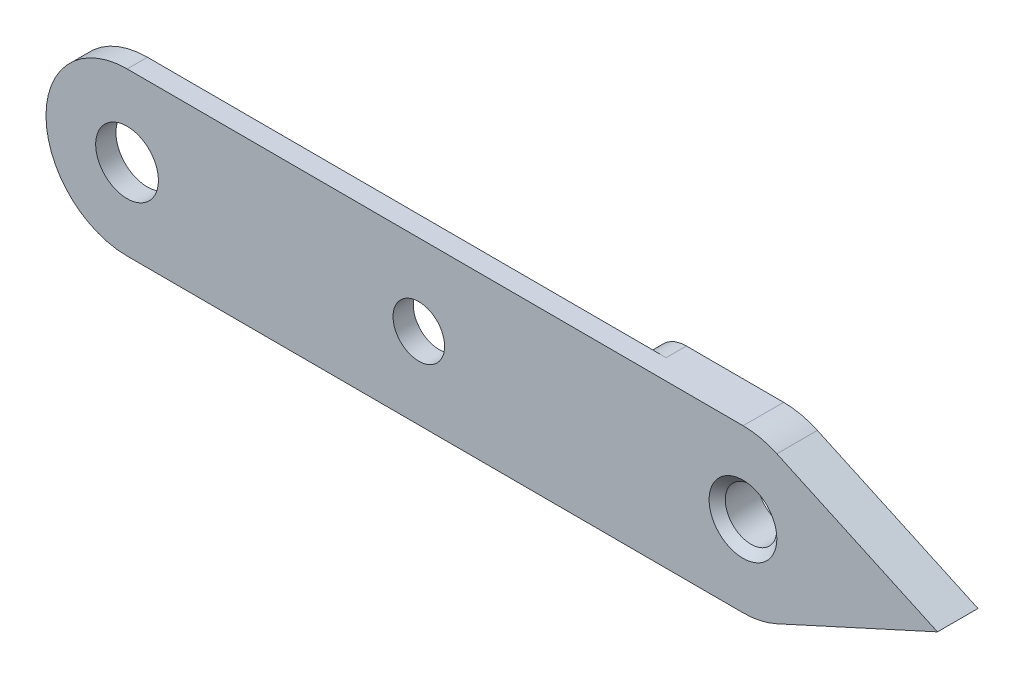
ISO-10303-21;
HEADER;
FILE_DESCRIPTION(('STEP AP214'),'2;1');
FILE_NAME('part.step','',(''),(''),'','','');
FILE_SCHEMA(('AUTOMOTIVE_DESIGN { 1 0 10303 214 1 1 1 1 }'));
ENDSEC;
DATA;
#1=APPLICATION_CONTEXT('core data for automotive mechanical design processes');
#2=APPLICATION_PROTOCOL_DEFINITION('international standard','automotive_design',2000,#1);
#3=PRODUCT_CONTEXT('',#1,'mechanical');
#4=PRODUCT('Part','Part','',(#3));
#5=PRODUCT_RELATED_PRODUCT_CATEGORY('part','',(#4));
#6=PRODUCT_DEFINITION_FORMATION('','',#4);
#7=PRODUCT_DEFINITION_CONTEXT('part definition',#1,'design');
#8=PRODUCT_DEFINITION('design','',#6,#7);
#9=PRODUCT_DEFINITION_SHAPE('','',#8);
#10=(LENGTH_UNIT() NAMED_UNIT(*) SI_UNIT(.MILLI.,.METRE.));
#11=(NAMED_UNIT(*) PLANE_ANGLE_UNIT() SI_UNIT($,.RADIAN.));
#12=(NAMED_UNIT(*) SI_UNIT($,.STERADIAN.) SOLID_ANGLE_UNIT());
#13=UNCERTAINTY_MEASURE_WITH_UNIT(LENGTH_MEASURE(1.E-05),#10,'distance_accuracy_value','');
#14=(GEOMETRIC_REPRESENTATION_CONTEXT(3) GLOBAL_UNCERTAINTY_ASSIGNED_CONTEXT((#13)) GLOBAL_UNIT_ASSIGNED_CONTEXT((#10,
#11,#12)) REPRESENTATION_CONTEXT('',''));
#15=CARTESIAN_POINT('',(0.,0.,0.));
#16=DIRECTION('',(0.,0.,1.));
#17=DIRECTION('',(1.,0.,0.));
#18=AXIS2_PLACEMENT_3D('',#15,#16,#17);
#19=CARTESIAN_POINT('',(25.3999650837235,-0.0421158595824525,-43.1124892474455));
#20=DIRECTION('',(0.,0.,-1.));
#21=DIRECTION('',(-1.,0.,0.));
#22=AXIS2_PLACEMENT_3D('',#19,#20,#21);
#23=CYLINDRICAL_SURFACE('',#22,6.35);
#24=DIRECTION('',(0.,0.,1.));
#25=VECTOR('',#24,1.);
#26=CARTESIAN_POINT('',(28.0362233260354,-5.81902182037516,-46.2874892474455));
#27=LINE('',#26,#25);
#28=CARTESIAN_POINT('',(28.0362233260354,-5.81902182037517,-46.2874892474455));
#29=VERTEX_POINT('',#28);
#30=CARTESIAN_POINT('',(28.0362233260354,-5.81902182037516,-43.1124892474455));
#31=VERTEX_POINT('',#30);
#32=EDGE_CURVE('E139',#29,#31,#27,.T.);
#33=ORIENTED_EDGE('',*,*,#32,.T.);
#34=CARTESIAN_POINT('',(25.3999650837235,-0.0421158595824525,-43.1124892474455));
#35=DIRECTION('',(0.,0.,1.));
#36=DIRECTION('',(1.,0.,0.));
#37=AXIS2_PLACEMENT_3D('',#34,#35,#36);
#38=CIRCLE('',#37,6.35);
#39=CARTESIAN_POINT('',(25.3894361188279,-6.39210713051332,-43.1124892474455));
#40=VERTEX_POINT('',#39);
#41=EDGE_CURVE('E240',#40,#31,#38,.T.);
#42=ORIENTED_EDGE('',*,*,#41,.F.);
#43=DIRECTION('',(0.,0.,-1.));
#44=VECTOR('',#43,1.);
#45=CARTESIAN_POINT('',(25.3894361188279,-6.39210713051332,-43.1124892474455));
#46=LINE('',#45,#44);
#47=CARTESIAN_POINT('',(25.3894361188279,-6.39210713051332,-46.2874892474455));
#48=VERTEX_POINT('',#47);
#49=EDGE_CURVE('E44',#40,#48,#46,.T.);
#50=ORIENTED_EDGE('',*,*,#49,.T.);
#51=CARTESIAN_POINT('',(25.3999650837235,-0.0421158595824525,-46.2874892474455));
#52=DIRECTION('',(0.,0.,-1.));
#53=DIRECTION('',(-1.,0.,0.));
#54=AXIS2_PLACEMENT_3D('',#51,#52,#53);
#55=CIRCLE('',#54,6.35);
#56=EDGE_CURVE('E166',#29,#48,#55,.T.);
#57=ORIENTED_EDGE('',*,*,#56,.F.);
#58=EDGE_LOOP('',(#33,#42,#50,#57));
#59=FACE_BOUND('',#58,.T.);
#60=ADVANCED_FACE('F35',(#59),#23,.T.);
#61=CARTESIAN_POINT('',(-22.8599685753512,0.0379042736241079,-43.1124892474455));
#62=DIRECTION('',(0.,0.,-1.));
#63=DIRECTION('',(-1.,0.,0.));
#64=AXIS2_PLACEMENT_3D('',#61,#62,#63);
#65=PLANE('',#64);
#66=CARTESIAN_POINT('',(0.,0.,-43.1124892474455));
#67=DIRECTION('',(0.,0.,1.));
#68=DIRECTION('',(1.,0.,0.));
#69=AXIS2_PLACEMENT_3D('',#66,#67,#68);
#70=CIRCLE('',#69,2.01929999999999);
#71=CARTESIAN_POINT('',(2.01929999999999,0.,-43.1124892474455));
#72=VERTEX_POINT('',#71);
#73=EDGE_CURVE('E145',#72,#72,#70,.T.);
#74=ORIENTED_EDGE('',*,*,#73,.F.);
#75=EDGE_LOOP('',(#74));
#76=FACE_BOUND('',#75,.T.);
#77=CARTESIAN_POINT('',(25.3999650837235,-0.0421158595824492,-43.1124892474455));
#78=DIRECTION('',(0.,0.,1.));
#79=DIRECTION('',(1.,0.,0.));
#80=AXIS2_PLACEMENT_3D('',#77,#78,#79);
#81=CIRCLE('',#80,2.6543);
#82=CARTESIAN_POINT('',(28.0542650837235,-0.0421158595824492,-43.1124892474455));
#83=VERTEX_POINT('',#82);
#84=EDGE_CURVE('E149',#83,#83,#81,.T.);
#85=ORIENTED_EDGE('',*,*,#84,.F.);
#86=EDGE_LOOP('',(#85));
#87=FACE_BOUND('',#86,.T.);
#88=CARTESIAN_POINT('',(-22.8599685753512,0.0379042736241113,-43.1124892474455));
#89=DIRECTION('',(0.,0.,1.));
#90=DIRECTION('',(1.,0.,0.));
#91=AXIS2_PLACEMENT_3D('',#88,#89,#90);
#92=CIRCLE('',#91,2.45744999999999);
#93=CARTESIAN_POINT('',(-20.4025185753512,0.0379042736241113,-43.1124892474455));
#94=VERTEX_POINT('',#93);
#95=EDGE_CURVE('E220',#94,#94,#92,.T.);
#96=ORIENTED_EDGE('',*,*,#95,.F.);
#97=EDGE_LOOP('',(#96));
#98=FACE_BOUND('',#97,.T.);
#99=CARTESIAN_POINT('',(-22.8599685753512,0.0379042736241079,-43.1124892474455));
#100=DIRECTION('',(0.,0.,1.));
#101=DIRECTION('',(-1.,0.,0.));
#102=AXIS2_PLACEMENT_3D('',#99,#100,#101);
#103=CIRCLE('',#102,6.35);
#104=CARTESIAN_POINT('',(-22.8494396104556,6.38789554455498,-43.1124892474455));
#105=VERTEX_POINT('',#104);
#106=CARTESIAN_POINT('',(-22.8704975402468,-6.31208699730676,-43.1124892474455));
#107=VERTEX_POINT('',#106);
#108=EDGE_CURVE('E214',#105,#107,#103,.T.);
#109=ORIENTED_EDGE('',*,*,#108,.T.);
#110=DIRECTION('',(0.999998625343444,-0.00165810470796851,0.));
#111=VECTOR('',#110,1.);
#112=CARTESIAN_POINT('',(-22.8704975402468,-6.31208699730676,-43.1124892474455));
#113=LINE('',#112,#111);
#114=EDGE_CURVE('E246',#107,#40,#113,.T.);
#115=ORIENTED_EDGE('',*,*,#114,.T.);
#116=ORIENTED_EDGE('',*,*,#41,.T.);
#117=DIRECTION('',(0.909748970203577,0.415158778316839,0.));
#118=VECTOR('',#117,1.);
#119=CARTESIAN_POINT('',(40.6399441339575,-0.0673853753318868,-43.1124892474455));
#120=LINE('',#119,#118);
#121=CARTESIAN_POINT('',(40.6399441339575,-0.0673853753318868,-43.1124892474455));
#122=VERTEX_POINT('',#121);
#123=EDGE_CURVE('E142',#31,#122,#120,.T.);
#124=ORIENTED_EDGE('',*,*,#123,.T.);
#125=DIRECTION('',(-0.908367216280271,0.418173409469364,0.));
#126=VECTOR('',#125,1.);
#127=CARTESIAN_POINT('',(28.0553662338539,5.72601596379727,-43.1124892474455));
#128=LINE('',#127,#126);
#129=CARTESIAN_POINT('',(28.0553662338539,5.72601596379727,-43.1124892474455));
#130=VERTEX_POINT('',#129);
#131=EDGE_CURVE('E125',#122,#130,#128,.T.);
#132=ORIENTED_EDGE('',*,*,#131,.T.);
#133=CARTESIAN_POINT('',(25.4104940486191,6.30787541134842,-43.1124892474455));
#134=VERTEX_POINT('',#133);
#135=EDGE_CURVE('E244',#130,#134,#38,.T.);
#136=ORIENTED_EDGE('',*,*,#135,.T.);
#137=DIRECTION('',(-0.999998625343444,0.00165810470796851,0.));
#138=VECTOR('',#137,1.);
#139=CARTESIAN_POINT('',(-22.8494396104556,6.38789554455498,-43.1124892474455));
#140=LINE('',#139,#138);
#141=EDGE_CURVE('E223',#134,#105,#140,.T.);
#142=ORIENTED_EDGE('',*,*,#141,.T.);
#143=EDGE_LOOP('',(#109,#115,#116,#124,#132,#136,#142));
#144=FACE_BOUND('',#143,.T.);
#145=ADVANCED_FACE('F261',(#76,#87,#98,#144),#65,.F.);
#146=CARTESIAN_POINT('',(-22.8599685753512,0.0379042736241079,-44.6999892474455));
#147=DIRECTION('',(0.,0.,-1.));
#148=DIRECTION('',(-1.,0.,0.));
#149=AXIS2_PLACEMENT_3D('',#146,#147,#148);
#150=PLANE('',#149);
#151=CARTESIAN_POINT('',(0.,0.,-44.6999892474455));
#152=DIRECTION('',(0.,0.,-1.));
#153=DIRECTION('',(-1.,0.,0.));
#154=AXIS2_PLACEMENT_3D('',#151,#152,#153);
#155=CIRCLE('',#154,2.01929999999999);
#156=CARTESIAN_POINT('',(-2.01929999999999,0.,-44.6999892474455));
#157=VERTEX_POINT('',#156);
#158=EDGE_CURVE('E39',#157,#157,#155,.T.);
#159=ORIENTED_EDGE('',*,*,#158,.F.);
#160=EDGE_LOOP('',(#159));
#161=FACE_BOUND('',#160,.T.);
#162=CARTESIAN_POINT('',(17.7736581796691,-3.83947586426625,-44.6999892474455));
#163=DIRECTION('',(0.,0.,-1.));
#164=DIRECTION('',(-1.,0.,0.));
#165=AXIS2_PLACEMENT_3D('',#162,#163,#164);
#166=CIRCLE('',#165,2.54);
#167=CARTESIAN_POINT('',(17.7694465937108,-6.3794723726386,-44.6999892474455));
#168=VERTEX_POINT('',#167);
#169=CARTESIAN_POINT('',(15.2336616712967,-3.83526427830801,-44.6999892474455));
#170=VERTEX_POINT('',#169);
#171=EDGE_CURVE('E172',#168,#170,#166,.T.);
#172=ORIENTED_EDGE('',*,*,#171,.F.);
#173=DIRECTION('',(0.999998625343444,-0.00165810470796851,0.));
#174=VECTOR('',#173,1.);
#175=CARTESIAN_POINT('',(-22.8704975402468,-6.31208699730676,-44.6999892474455));
#176=LINE('',#175,#174);
#177=CARTESIAN_POINT('',(-22.8704975402468,-6.31208699730676,-44.6999892474455));
#178=VERTEX_POINT('',#177);
#179=EDGE_CURVE('E197',#178,#168,#176,.T.);
#180=ORIENTED_EDGE('',*,*,#179,.F.);
#181=CARTESIAN_POINT('',(-22.8599685753512,0.0379042736241079,-44.6999892474455));
#182=DIRECTION('',(0.,0.,1.));
#183=DIRECTION('',(-1.,0.,0.));
#184=AXIS2_PLACEMENT_3D('',#181,#182,#183);
#185=CIRCLE('',#184,6.35);
#186=CARTESIAN_POINT('',(-22.8494396104556,6.38789554455498,-44.6999892474455));
#187=VERTEX_POINT('',#186);
#188=EDGE_CURVE('E213',#187,#178,#185,.T.);
#189=ORIENTED_EDGE('',*,*,#188,.F.);
#190=DIRECTION('',(-0.999998625343444,0.00165810470796851,0.));
#191=VECTOR('',#190,1.);
#192=CARTESIAN_POINT('',(-22.8494396104556,6.38789554455498,-44.6999892474455));
#193=LINE('',#192,#191);
#194=CARTESIAN_POINT('',(17.790504523502,6.32051016922314,-44.6999892474455));
#195=VERTEX_POINT('',#194);
#196=EDGE_CURVE('E212',#195,#187,#193,.T.);
#197=ORIENTED_EDGE('',*,*,#196,.F.);
#198=CARTESIAN_POINT('',(17.7862929375438,3.78051366085079,-44.6999892474455));
#199=DIRECTION('',(0.,0.,-1.));
#200=DIRECTION('',(-1.,0.,0.));
#201=AXIS2_PLACEMENT_3D('',#198,#199,#200);
#202=CIRCLE('',#201,2.54);
#203=CARTESIAN_POINT('',(15.2462964291714,3.78472524680903,-44.6999892474455));
#204=VERTEX_POINT('',#203);
#205=EDGE_CURVE('E160',#204,#195,#202,.T.);
#206=ORIENTED_EDGE('',*,*,#205,.F.);
#207=DIRECTION('',(0.00165810470796857,0.999998625343444,0.));
#208=VECTOR('',#207,1.);
#209=CARTESIAN_POINT('',(15.2336616712967,-3.83526427830801,-44.6999892474455));
#210=LINE('',#209,#208);
#211=EDGE_CURVE('E60',#170,#204,#210,.T.);
#212=ORIENTED_EDGE('',*,*,#211,.F.);
#213=EDGE_LOOP('',(#172,#180,#189,#197,#206,#212));
#214=FACE_BOUND('',#213,.T.);
#215=CARTESIAN_POINT('',(-22.8599685753512,0.0379042736241113,-44.6999892474455));
#216=DIRECTION('',(0.,0.,1.));
#217=DIRECTION('',(1.,0.,0.));
#218=AXIS2_PLACEMENT_3D('',#215,#216,#217);
#219=CIRCLE('',#218,2.45745);
#220=CARTESIAN_POINT('',(-20.4025185753512,0.0379042736241113,-44.6999892474455));
#221=VERTEX_POINT('',#220);
#222=EDGE_CURVE('E215',#221,#221,#219,.T.);
#223=ORIENTED_EDGE('',*,*,#222,.T.);
#224=EDGE_LOOP('',(#223));
#225=FACE_BOUND('',#224,.T.);
#226=ADVANCED_FACE('F263',(#161,#214,#225),#150,.T.);
#227=CARTESIAN_POINT('',(-22.8599685753512,0.0379042736241079,-43.1124892474455));
#228=DIRECTION('',(0.,0.,-1.));
#229=DIRECTION('',(-1.,0.,0.));
#230=AXIS2_PLACEMENT_3D('',#227,#228,#229);
#231=CYLINDRICAL_SURFACE('',#230,6.35);
#232=ORIENTED_EDGE('',*,*,#188,.T.);
#233=DIRECTION('',(0.,0.,-1.));
#234=VECTOR('',#233,1.);
#235=CARTESIAN_POINT('',(-22.8704975402468,-6.31208699730676,-43.1124892474455));
#236=LINE('',#235,#234);
#237=EDGE_CURVE('E11',#107,#178,#236,.T.);
#238=ORIENTED_EDGE('',*,*,#237,.F.);
#239=ORIENTED_EDGE('',*,*,#108,.F.);
#240=DIRECTION('',(0.,0.,-1.));
#241=VECTOR('',#240,1.);
#242=CARTESIAN_POINT('',(-22.8494396104556,6.38789554455498,-43.1124892474455));
#243=LINE('',#242,#241);
#244=EDGE_CURVE('E229',#105,#187,#243,.T.);
#245=ORIENTED_EDGE('',*,*,#244,.T.);
#246=EDGE_LOOP('',(#232,#238,#239,#245));
#247=FACE_BOUND('',#246,.T.);
#248=ADVANCED_FACE('F37',(#247),#231,.T.);
#249=CARTESIAN_POINT('',(-22.8704975402468,-6.31208699730676,-43.1124892474455));
#250=DIRECTION('',(0.00165810470796851,0.999998625343444,0.));
#251=DIRECTION('',(-0.999998625343444,0.00165810470796851,0.));
#252=AXIS2_PLACEMENT_3D('',#249,#250,#251);
#253=PLANE('',#252);
#254=ORIENTED_EDGE('',*,*,#179,.T.);
#255=DIRECTION('',(0.,0.,1.));
#256=VECTOR('',#255,1.);
#257=CARTESIAN_POINT('',(17.7694465937108,-6.37947237263859,-46.2874892474455));
#258=LINE('',#257,#256);
#259=CARTESIAN_POINT('',(17.7694465937108,-6.37947237263859,-46.2874892474455));
#260=VERTEX_POINT('',#259);
#261=EDGE_CURVE('E170',#260,#168,#258,.T.);
#262=ORIENTED_EDGE('',*,*,#261,.F.);
#263=DIRECTION('',(-0.999998625343444,0.00165810470796926,0.));
#264=VECTOR('',#263,1.);
#265=CARTESIAN_POINT('',(25.3894361188279,-6.39210713051332,-46.2874892474455));
#266=LINE('',#265,#264);
#267=EDGE_CURVE('E168',#48,#260,#266,.T.);
#268=ORIENTED_EDGE('',*,*,#267,.F.);
#269=ORIENTED_EDGE('',*,*,#49,.F.);
#270=ORIENTED_EDGE('',*,*,#114,.F.);
#271=ORIENTED_EDGE('',*,*,#237,.T.);
#272=EDGE_LOOP('',(#254,#262,#268,#269,#270,#271));
#273=FACE_BOUND('',#272,.T.);
#274=ADVANCED_FACE('F207',(#273),#253,.F.);
#275=ORIENTED_EDGE('',*,*,#135,.F.);
#276=DIRECTION('',(0.,0.,1.));
#277=VECTOR('',#276,1.);
#278=CARTESIAN_POINT('',(28.0553662338539,5.72601596379727,-46.2874892474455));
#279=LINE('',#278,#277);
#280=CARTESIAN_POINT('',(28.0553662338539,5.72601596379727,-46.2874892474455));
#281=VERTEX_POINT('',#280);
#282=EDGE_CURVE('E128',#281,#130,#279,.T.);
#283=ORIENTED_EDGE('',*,*,#282,.F.);
#284=CARTESIAN_POINT('',(25.4104940486191,6.30787541134842,-46.2874892474455));
#285=VERTEX_POINT('',#284);
#286=EDGE_CURVE('E135',#285,#281,#55,.T.);
#287=ORIENTED_EDGE('',*,*,#286,.F.);
#288=DIRECTION('',(0.,0.,-1.));
#289=VECTOR('',#288,1.);
#290=CARTESIAN_POINT('',(25.4104940486191,6.30787541134842,-43.1124892474455));
#291=LINE('',#290,#289);
#292=EDGE_CURVE('E233',#134,#285,#291,.T.);
#293=ORIENTED_EDGE('',*,*,#292,.F.);
#294=EDGE_LOOP('',(#275,#283,#287,#293));
#295=FACE_BOUND('',#294,.T.);
#296=ADVANCED_FACE('F268',(#295),#23,.T.);
#297=CARTESIAN_POINT('',(-22.8494396104556,6.38789554455498,-43.1124892474455));
#298=DIRECTION('',(-0.00165810470796851,-0.999998625343444,0.));
#299=DIRECTION('',(0.999998625343444,-0.00165810470796851,0.));
#300=AXIS2_PLACEMENT_3D('',#297,#298,#299);
#301=PLANE('',#300);
#302=ORIENTED_EDGE('',*,*,#292,.T.);
#303=DIRECTION('',(0.999998625343444,-0.00165810470796914,0.));
#304=VECTOR('',#303,1.);
#305=CARTESIAN_POINT('',(17.790504523502,6.32051016922314,-46.2874892474455));
#306=LINE('',#305,#304);
#307=CARTESIAN_POINT('',(17.790504523502,6.32051016922314,-46.2874892474455));
#308=VERTEX_POINT('',#307);
#309=EDGE_CURVE('E164',#308,#285,#306,.T.);
#310=ORIENTED_EDGE('',*,*,#309,.F.);
#311=DIRECTION('',(0.,0.,1.));
#312=VECTOR('',#311,1.);
#313=CARTESIAN_POINT('',(17.790504523502,6.32051016922314,-46.2874892474455));
#314=LINE('',#313,#312);
#315=EDGE_CURVE('E183',#308,#195,#314,.T.);
#316=ORIENTED_EDGE('',*,*,#315,.T.);
#317=ORIENTED_EDGE('',*,*,#196,.T.);
#318=ORIENTED_EDGE('',*,*,#244,.F.);
#319=ORIENTED_EDGE('',*,*,#141,.F.);
#320=EDGE_LOOP('',(#302,#310,#316,#317,#318,#319));
#321=FACE_BOUND('',#320,.T.);
#322=ADVANCED_FACE('F280',(#321),#301,.F.);
#323=CARTESIAN_POINT('',(-22.8599685753512,0.0379042736241113,-43.1124892474455));
#324=DIRECTION('',(0.,0.,1.));
#325=DIRECTION('',(1.,0.,0.));
#326=AXIS2_PLACEMENT_3D('',#323,#324,#325);
#327=CYLINDRICAL_SURFACE('',#326,2.45744999999999);
#328=ORIENTED_EDGE('',*,*,#222,.F.);
#329=EDGE_LOOP('',(#328));
#330=FACE_BOUND('',#329,.T.);
#331=ORIENTED_EDGE('',*,*,#95,.T.);
#332=EDGE_LOOP('',(#331));
#333=FACE_BOUND('',#332,.T.);
#334=ADVANCED_FACE('F285',(#330,#333),#327,.F.);
#335=CARTESIAN_POINT('',(17.7736581796691,-3.83947586426625,-46.2874892474455));
#336=DIRECTION('',(0.,0.,-1.));
#337=DIRECTION('',(-1.,0.,0.));
#338=AXIS2_PLACEMENT_3D('',#335,#336,#337);
#339=PLANE('',#338);
#340=CARTESIAN_POINT('',(25.3999650837235,-0.0421158595824492,-46.2874892474455));
#341=DIRECTION('',(0.,0.,-1.));
#342=DIRECTION('',(-1.,0.,0.));
#343=AXIS2_PLACEMENT_3D('',#340,#341,#342);
#344=CIRCLE('',#343,2.01929999999999);
#345=CARTESIAN_POINT('',(23.3806650837235,-0.0421158595824492,-46.2874892474455));
#346=VERTEX_POINT('',#345);
#347=EDGE_CURVE('E156',#346,#346,#344,.T.);
#348=ORIENTED_EDGE('',*,*,#347,.F.);
#349=EDGE_LOOP('',(#348));
#350=FACE_BOUND('',#349,.T.);
#351=CARTESIAN_POINT('',(17.7736581796691,-3.83947586426625,-46.2874892474455));
#352=DIRECTION('',(0.,0.,-1.));
#353=DIRECTION('',(-1.,0.,0.));
#354=AXIS2_PLACEMENT_3D('',#351,#352,#353);
#355=CIRCLE('',#354,2.54);
#356=CARTESIAN_POINT('',(15.2336616712967,-3.83526427830801,-46.2874892474455));
#357=VERTEX_POINT('',#356);
#358=EDGE_CURVE('E157',#260,#357,#355,.T.);
#359=ORIENTED_EDGE('',*,*,#358,.T.);
#360=DIRECTION('',(0.00165810470796857,0.999998625343444,0.));
#361=VECTOR('',#360,1.);
#362=CARTESIAN_POINT('',(15.2336616712967,-3.83526427830801,-46.2874892474455));
#363=LINE('',#362,#361);
#364=CARTESIAN_POINT('',(15.2462964291714,3.78472524680903,-46.2874892474455));
#365=VERTEX_POINT('',#364);
#366=EDGE_CURVE('E159',#357,#365,#363,.T.);
#367=ORIENTED_EDGE('',*,*,#366,.T.);
#368=CARTESIAN_POINT('',(17.7862929375438,3.78051366085079,-46.2874892474455));
#369=DIRECTION('',(0.,0.,-1.));
#370=DIRECTION('',(-1.,0.,0.));
#371=AXIS2_PLACEMENT_3D('',#368,#369,#370);
#372=CIRCLE('',#371,2.54);
#373=EDGE_CURVE('E162',#365,#308,#372,.T.);
#374=ORIENTED_EDGE('',*,*,#373,.T.);
#375=ORIENTED_EDGE('',*,*,#309,.T.);
#376=ORIENTED_EDGE('',*,*,#286,.T.);
#377=DIRECTION('',(-0.908367216280271,0.418173409469364,0.));
#378=VECTOR('',#377,1.);
#379=CARTESIAN_POINT('',(28.0553662338539,5.72601596379727,-46.2874892474455));
#380=LINE('',#379,#378);
#381=CARTESIAN_POINT('',(40.6399441339575,-0.0673853753318868,-46.2874892474455));
#382=VERTEX_POINT('',#381);
#383=EDGE_CURVE('E122',#382,#281,#380,.T.);
#384=ORIENTED_EDGE('',*,*,#383,.F.);
#385=DIRECTION('',(0.909748970203577,0.415158778316839,0.));
#386=VECTOR('',#385,1.);
#387=CARTESIAN_POINT('',(40.6399441339575,-0.0673853753318868,-46.2874892474455));
#388=LINE('',#387,#386);
#389=EDGE_CURVE('E52',#29,#382,#388,.T.);
#390=ORIENTED_EDGE('',*,*,#389,.F.);
#391=ORIENTED_EDGE('',*,*,#56,.T.);
#392=ORIENTED_EDGE('',*,*,#267,.T.);
#393=EDGE_LOOP('',(#359,#367,#374,#375,#376,#384,#390,#391,#392));
#394=FACE_BOUND('',#393,.T.);
#395=ADVANCED_FACE('F132',(#350,#394),#339,.T.);
#396=CARTESIAN_POINT('',(17.7862929375438,3.78051366085079,-46.2874892474455));
#397=DIRECTION('',(0.,0.,1.));
#398=DIRECTION('',(1.,0.,0.));
#399=AXIS2_PLACEMENT_3D('',#396,#397,#398);
#400=CYLINDRICAL_SURFACE('',#399,2.54);
#401=ORIENTED_EDGE('',*,*,#205,.T.);
#402=ORIENTED_EDGE('',*,*,#315,.F.);
#403=ORIENTED_EDGE('',*,*,#373,.F.);
#404=DIRECTION('',(0.,0.,1.));
#405=VECTOR('',#404,1.);
#406=CARTESIAN_POINT('',(15.2462964291714,3.78472524680903,-46.2874892474455));
#407=LINE('',#406,#405);
#408=EDGE_CURVE('E175',#365,#204,#407,.T.);
#409=ORIENTED_EDGE('',*,*,#408,.T.);
#410=EDGE_LOOP('',(#401,#402,#403,#409));
#411=FACE_BOUND('',#410,.T.);
#412=ADVANCED_FACE('F257',(#411),#400,.T.);
#413=CARTESIAN_POINT('',(15.2336616712967,-3.83526427830801,-46.2874892474455));
#414=DIRECTION('',(0.999998625343444,-0.00165810470796857,0.));
#415=DIRECTION('',(0.00165810470796857,0.999998625343444,0.));
#416=AXIS2_PLACEMENT_3D('',#413,#414,#415);
#417=PLANE('',#416);
#418=ORIENTED_EDGE('',*,*,#211,.T.);
#419=ORIENTED_EDGE('',*,*,#408,.F.);
#420=ORIENTED_EDGE('',*,*,#366,.F.);
#421=DIRECTION('',(0.,0.,1.));
#422=VECTOR('',#421,1.);
#423=CARTESIAN_POINT('',(15.2336616712967,-3.83526427830801,-46.2874892474455));
#424=LINE('',#423,#422);
#425=EDGE_CURVE('E251',#357,#170,#424,.T.);
#426=ORIENTED_EDGE('',*,*,#425,.T.);
#427=EDGE_LOOP('',(#418,#419,#420,#426));
#428=FACE_BOUND('',#427,.T.);
#429=ADVANCED_FACE('F259',(#428),#417,.F.);
#430=CARTESIAN_POINT('',(17.7736581796691,-3.83947586426625,-46.2874892474455));
#431=DIRECTION('',(0.,0.,1.));
#432=DIRECTION('',(1.,0.,0.));
#433=AXIS2_PLACEMENT_3D('',#430,#431,#432);
#434=CYLINDRICAL_SURFACE('',#433,2.54);
#435=ORIENTED_EDGE('',*,*,#171,.T.);
#436=ORIENTED_EDGE('',*,*,#425,.F.);
#437=ORIENTED_EDGE('',*,*,#358,.F.);
#438=ORIENTED_EDGE('',*,*,#261,.T.);
#439=EDGE_LOOP('',(#435,#436,#437,#438));
#440=FACE_BOUND('',#439,.T.);
#441=ADVANCED_FACE('F203',(#440),#434,.T.);
#442=CARTESIAN_POINT('',(25.3999650837235,-0.0421158595824492,-43.1124892474455));
#443=DIRECTION('',(0.,0.,1.));
#444=DIRECTION('',(1.,0.,0.));
#445=AXIS2_PLACEMENT_3D('',#442,#443,#444);
#446=CYLINDRICAL_SURFACE('',#445,2.01929999999999);
#447=ORIENTED_EDGE('',*,*,#347,.T.);
#448=EDGE_LOOP('',(#447));
#449=FACE_BOUND('',#448,.T.);
#450=CARTESIAN_POINT('',(25.3999650837235,-0.0421158595824492,-43.7474892474455));
#451=DIRECTION('',(0.,0.,1.));
#452=DIRECTION('',(1.,0.,0.));
#453=AXIS2_PLACEMENT_3D('',#450,#451,#452);
#454=CIRCLE('',#453,2.0193);
#455=CARTESIAN_POINT('',(27.4192650837235,-0.0421158595824492,-43.7474892474455));
#456=VERTEX_POINT('',#455);
#457=EDGE_CURVE('E153',#456,#456,#454,.T.);
#458=ORIENTED_EDGE('',*,*,#457,.T.);
#459=EDGE_LOOP('',(#458));
#460=FACE_BOUND('',#459,.T.);
#461=ADVANCED_FACE('F303',(#449,#460),#446,.F.);
#462=CARTESIAN_POINT('',(25.3999650837235,-0.0421158595824492,-43.1124892474455));
#463=DIRECTION('',(0.,0.,1.));
#464=DIRECTION('',(1.,0.,0.));
#465=AXIS2_PLACEMENT_3D('',#462,#463,#464);
#466=CONICAL_SURFACE('',#465,2.6543,0.785398163397451);
#467=ORIENTED_EDGE('',*,*,#457,.F.);
#468=EDGE_LOOP('',(#467));
#469=FACE_BOUND('',#468,.T.);
#470=ORIENTED_EDGE('',*,*,#84,.T.);
#471=EDGE_LOOP('',(#470));
#472=FACE_BOUND('',#471,.T.);
#473=ADVANCED_FACE('F310',(#469,#472),#466,.F.);
#474=CARTESIAN_POINT('',(40.6399441339575,-0.0673853753318868,-46.2874892474455));
#475=DIRECTION('',(0.415158778316839,-0.909748970203577,0.));
#476=DIRECTION('',(0.909748970203577,0.415158778316839,0.));
#477=AXIS2_PLACEMENT_3D('',#474,#475,#476);
#478=PLANE('',#477);
#479=ORIENTED_EDGE('',*,*,#123,.F.);
#480=ORIENTED_EDGE('',*,*,#32,.F.);
#481=ORIENTED_EDGE('',*,*,#389,.T.);
#482=DIRECTION('',(0.,0.,1.));
#483=VECTOR('',#482,1.);
#484=CARTESIAN_POINT('',(40.6399441339575,-0.0673853753318868,-46.2874892474455));
#485=LINE('',#484,#483);
#486=EDGE_CURVE('E120',#382,#122,#485,.T.);
#487=ORIENTED_EDGE('',*,*,#486,.T.);
#488=EDGE_LOOP('',(#479,#480,#481,#487));
#489=FACE_BOUND('',#488,.T.);
#490=ADVANCED_FACE('F137',(#489),#478,.T.);
#491=CARTESIAN_POINT('',(28.0553662338539,5.72601596379727,-46.2874892474455));
#492=DIRECTION('',(0.418173409469364,0.90836721628027,0.));
#493=DIRECTION('',(-0.908367216280271,0.418173409469364,0.));
#494=AXIS2_PLACEMENT_3D('',#491,#492,#493);
#495=PLANE('',#494);
#496=ORIENTED_EDGE('',*,*,#131,.F.);
#497=ORIENTED_EDGE('',*,*,#486,.F.);
#498=ORIENTED_EDGE('',*,*,#383,.T.);
#499=ORIENTED_EDGE('',*,*,#282,.T.);
#500=EDGE_LOOP('',(#496,#497,#498,#499));
#501=FACE_BOUND('',#500,.T.);
#502=ADVANCED_FACE('F121',(#501),#495,.T.);
#503=CARTESIAN_POINT('',(0.,0.,-43.1124892474455));
#504=DIRECTION('',(0.,0.,1.));
#505=DIRECTION('',(1.,0.,0.));
#506=AXIS2_PLACEMENT_3D('',#503,#504,#505);
#507=CYLINDRICAL_SURFACE('',#506,2.01929999999999);
#508=ORIENTED_EDGE('',*,*,#158,.T.);
#509=EDGE_LOOP('',(#508));
#510=FACE_BOUND('',#509,.T.);
#511=ORIENTED_EDGE('',*,*,#73,.T.);
#512=EDGE_LOOP('',(#511));
#513=FACE_BOUND('',#512,.T.);
#514=ADVANCED_FACE('F318',(#510,#513),#507,.F.);
#515=CLOSED_SHELL('',(#60,#145,#226,#248,#274,#296,#322,#334,#395,#412,#429,#441,#461,#473,#490,
#502,#514));
#516=MANIFOLD_SOLID_BREP('B2',#515);
#517=ADVANCED_BREP_SHAPE_REPRESENTATION('',(#18,#516),#14);
#518=SHAPE_DEFINITION_REPRESENTATION(#9,#517);
ENDSEC;
END-ISO-10303-21;
